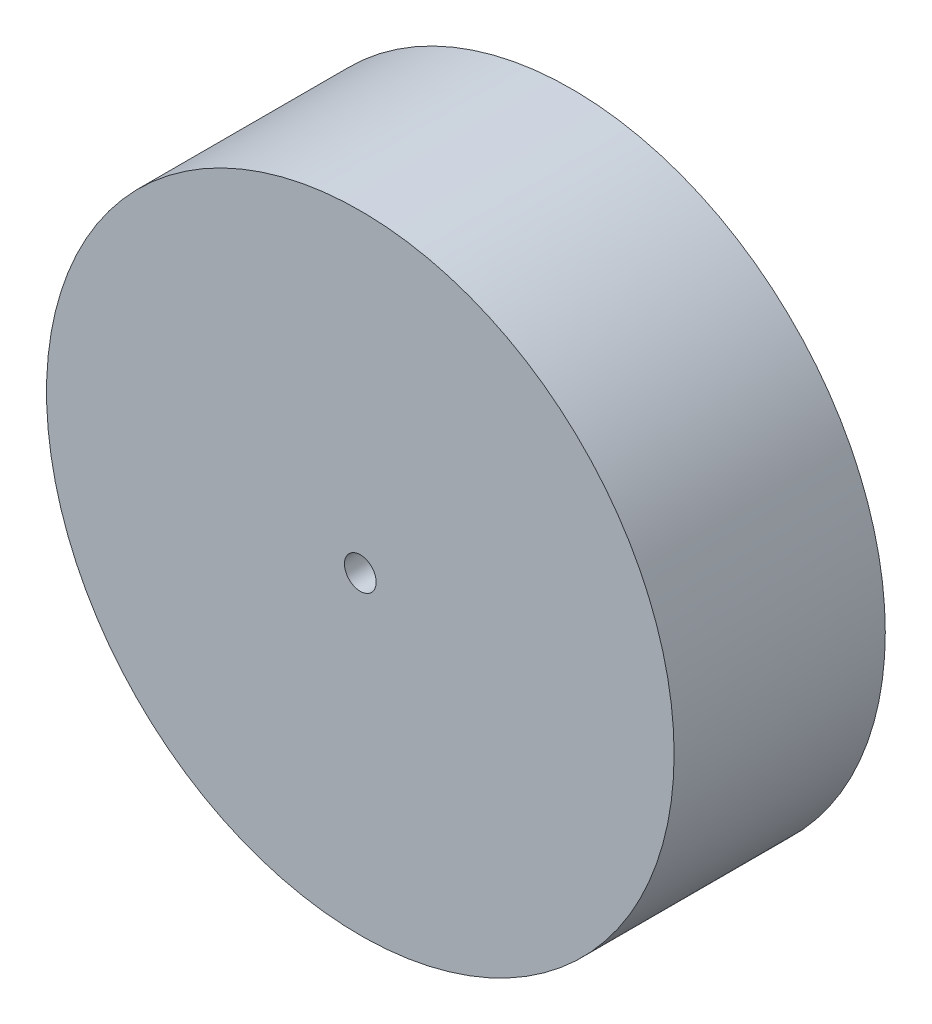
ISO-10303-21;
HEADER;
FILE_DESCRIPTION(('STEP AP214'),'2;1');
FILE_NAME('part.step','',(''),(''),'','','');
FILE_SCHEMA(('AUTOMOTIVE_DESIGN { 1 0 10303 214 1 1 1 1 }'));
ENDSEC;
DATA;
#1=APPLICATION_CONTEXT('core data for automotive mechanical design processes');
#2=APPLICATION_PROTOCOL_DEFINITION('international standard','automotive_design',2000,#1);
#3=PRODUCT_CONTEXT('',#1,'mechanical');
#4=PRODUCT('Part','Part','',(#3));
#5=PRODUCT_RELATED_PRODUCT_CATEGORY('part','',(#4));
#6=PRODUCT_DEFINITION_FORMATION('','',#4);
#7=PRODUCT_DEFINITION_CONTEXT('part definition',#1,'design');
#8=PRODUCT_DEFINITION('design','',#6,#7);
#9=PRODUCT_DEFINITION_SHAPE('','',#8);
#10=(LENGTH_UNIT() NAMED_UNIT(*) SI_UNIT(.MILLI.,.METRE.));
#11=(NAMED_UNIT(*) PLANE_ANGLE_UNIT() SI_UNIT($,.RADIAN.));
#12=(NAMED_UNIT(*) SI_UNIT($,.STERADIAN.) SOLID_ANGLE_UNIT());
#13=UNCERTAINTY_MEASURE_WITH_UNIT(LENGTH_MEASURE(1.E-05),#10,'distance_accuracy_value','');
#14=(GEOMETRIC_REPRESENTATION_CONTEXT(3) GLOBAL_UNCERTAINTY_ASSIGNED_CONTEXT((#13)) GLOBAL_UNIT_ASSIGNED_CONTEXT((#10,
#11,#12)) REPRESENTATION_CONTEXT('',''));
#15=CARTESIAN_POINT('',(0.,0.,0.));
#16=DIRECTION('',(0.,0.,1.));
#17=DIRECTION('',(1.,0.,0.));
#18=AXIS2_PLACEMENT_3D('',#15,#16,#17);
#19=CARTESIAN_POINT('',(0.,0.,10.));
#20=DIRECTION('',(0.,0.,1.));
#21=DIRECTION('',(1.,0.,0.));
#22=AXIS2_PLACEMENT_3D('',#19,#20,#21);
#23=PLANE('',#22);
#24=CARTESIAN_POINT('',(0.,0.,10.));
#25=DIRECTION('',(0.,0.,1.));
#26=DIRECTION('',(1.,0.,0.));
#27=AXIS2_PLACEMENT_3D('',#24,#25,#26);
#28=CIRCLE('',#27,14.859);
#29=CARTESIAN_POINT('',(14.859,0.,10.));
#30=VERTEX_POINT('',#29);
#31=EDGE_CURVE('E10',#30,#30,#28,.T.);
#32=ORIENTED_EDGE('',*,*,#31,.T.);
#33=EDGE_LOOP('',(#32));
#34=FACE_BOUND('',#33,.T.);
#35=CARTESIAN_POINT('',(0.,0.,10.));
#36=DIRECTION('',(0.,0.,1.));
#37=DIRECTION('',(1.,0.,0.));
#38=AXIS2_PLACEMENT_3D('',#35,#36,#37);
#39=CIRCLE('',#38,0.750000000000001);
#40=CARTESIAN_POINT('',(0.750000000000001,0.,10.));
#41=VERTEX_POINT('',#40);
#42=EDGE_CURVE('E49',#41,#41,#39,.T.);
#43=ORIENTED_EDGE('',*,*,#42,.F.);
#44=EDGE_LOOP('',(#43));
#45=FACE_BOUND('',#44,.T.);
#46=ADVANCED_FACE('F38',(#34,#45),#23,.T.);
#47=CARTESIAN_POINT('',(0.,0.,0.));
#48=DIRECTION('',(0.,0.,1.));
#49=DIRECTION('',(1.,0.,0.));
#50=AXIS2_PLACEMENT_3D('',#47,#48,#49);
#51=PLANE('',#50);
#52=CARTESIAN_POINT('',(0.,0.,0.));
#53=DIRECTION('',(0.,0.,1.));
#54=DIRECTION('',(1.,0.,0.));
#55=AXIS2_PLACEMENT_3D('',#52,#53,#54);
#56=CIRCLE('',#55,14.859);
#57=CARTESIAN_POINT('',(14.859,0.,0.));
#58=VERTEX_POINT('',#57);
#59=EDGE_CURVE('E42',#58,#58,#56,.T.);
#60=ORIENTED_EDGE('',*,*,#59,.F.);
#61=EDGE_LOOP('',(#60));
#62=FACE_BOUND('',#61,.T.);
#63=CARTESIAN_POINT('',(0.,0.,0.));
#64=DIRECTION('',(0.,0.,1.));
#65=DIRECTION('',(1.,0.,0.));
#66=AXIS2_PLACEMENT_3D('',#63,#64,#65);
#67=CIRCLE('',#66,0.750000000000001);
#68=CARTESIAN_POINT('',(0.750000000000001,0.,0.));
#69=VERTEX_POINT('',#68);
#70=EDGE_CURVE('E51',#69,#69,#67,.T.);
#71=ORIENTED_EDGE('',*,*,#70,.T.);
#72=EDGE_LOOP('',(#71));
#73=FACE_BOUND('',#72,.T.);
#74=ADVANCED_FACE('F61',(#62,#73),#51,.F.);
#75=CARTESIAN_POINT('',(0.,0.,10.));
#76=DIRECTION('',(0.,0.,-1.));
#77=DIRECTION('',(-1.,0.,0.));
#78=AXIS2_PLACEMENT_3D('',#75,#76,#77);
#79=CYLINDRICAL_SURFACE('',#78,14.859);
#80=ORIENTED_EDGE('',*,*,#31,.F.);
#81=EDGE_LOOP('',(#80));
#82=FACE_BOUND('',#81,.T.);
#83=ORIENTED_EDGE('',*,*,#59,.T.);
#84=EDGE_LOOP('',(#83));
#85=FACE_BOUND('',#84,.T.);
#86=ADVANCED_FACE('F40',(#82,#85),#79,.T.);
#87=CARTESIAN_POINT('',(0.,0.,10.));
#88=DIRECTION('',(0.,0.,-1.));
#89=DIRECTION('',(-1.,0.,0.));
#90=AXIS2_PLACEMENT_3D('',#87,#88,#89);
#91=CYLINDRICAL_SURFACE('',#90,0.750000000000001);
#92=ORIENTED_EDGE('',*,*,#42,.T.);
#93=EDGE_LOOP('',(#92));
#94=FACE_BOUND('',#93,.T.);
#95=ORIENTED_EDGE('',*,*,#70,.F.);
#96=EDGE_LOOP('',(#95));
#97=FACE_BOUND('',#96,.T.);
#98=ADVANCED_FACE('F57',(#94,#97),#91,.F.);
#99=CLOSED_SHELL('',(#46,#74,#86,#98));
#100=MANIFOLD_SOLID_BREP('B2',#99);
#101=ADVANCED_BREP_SHAPE_REPRESENTATION('',(#18,#100),#14);
#102=SHAPE_DEFINITION_REPRESENTATION(#9,#101);
ENDSEC;
END-ISO-10303-21;
